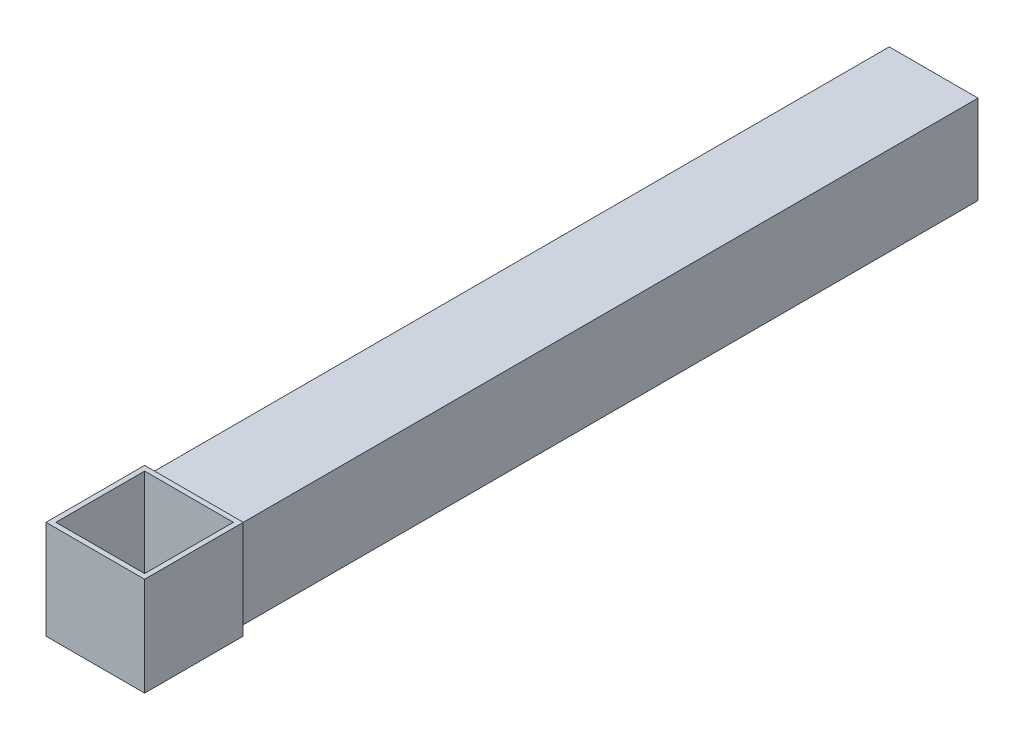
ISO-10303-21;
HEADER;
FILE_DESCRIPTION(('STEP AP214'),'2;1');
FILE_NAME('part.step','',(''),(''),'','','');
FILE_SCHEMA(('AUTOMOTIVE_DESIGN { 1 0 10303 214 1 1 1 1 }'));
ENDSEC;
DATA;
#1=APPLICATION_CONTEXT('core data for automotive mechanical design processes');
#2=APPLICATION_PROTOCOL_DEFINITION('international standard','automotive_design',2000,#1);
#3=PRODUCT_CONTEXT('',#1,'mechanical');
#4=PRODUCT('Part','Part','',(#3));
#5=PRODUCT_RELATED_PRODUCT_CATEGORY('part','',(#4));
#6=PRODUCT_DEFINITION_FORMATION('','',#4);
#7=PRODUCT_DEFINITION_CONTEXT('part definition',#1,'design');
#8=PRODUCT_DEFINITION('design','',#6,#7);
#9=PRODUCT_DEFINITION_SHAPE('','',#8);
#10=(LENGTH_UNIT() NAMED_UNIT(*) SI_UNIT(.MILLI.,.METRE.));
#11=(NAMED_UNIT(*) PLANE_ANGLE_UNIT() SI_UNIT($,.RADIAN.));
#12=(NAMED_UNIT(*) SI_UNIT($,.STERADIAN.) SOLID_ANGLE_UNIT());
#13=UNCERTAINTY_MEASURE_WITH_UNIT(LENGTH_MEASURE(1.E-05),#10,'distance_accuracy_value','');
#14=(GEOMETRIC_REPRESENTATION_CONTEXT(3) GLOBAL_UNCERTAINTY_ASSIGNED_CONTEXT((#13)) GLOBAL_UNIT_ASSIGNED_CONTEXT((#10,
#11,#12)) REPRESENTATION_CONTEXT('',''));
#15=CARTESIAN_POINT('',(0.,0.,0.));
#16=DIRECTION('',(0.,0.,1.));
#17=DIRECTION('',(1.,0.,0.));
#18=AXIS2_PLACEMENT_3D('',#15,#16,#17);
#19=CARTESIAN_POINT('',(18.,-18.,300.));
#20=DIRECTION('',(-1.,0.,0.));
#21=DIRECTION('',(0.,0.,1.));
#22=AXIS2_PLACEMENT_3D('',#19,#20,#21);
#23=PLANE('',#22);
#24=DIRECTION('',(0.,1.,0.));
#25=VECTOR('',#24,1.);
#26=CARTESIAN_POINT('',(18.,-18.,0.));
#27=LINE('',#26,#25);
#28=CARTESIAN_POINT('',(18.,-18.,0.));
#29=VERTEX_POINT('',#28);
#30=CARTESIAN_POINT('',(18.,18.,0.));
#31=VERTEX_POINT('',#30);
#32=EDGE_CURVE('E200',#29,#31,#27,.T.);
#33=ORIENTED_EDGE('',*,*,#32,.T.);
#34=DIRECTION('',(0.,0.,-1.));
#35=VECTOR('',#34,1.);
#36=CARTESIAN_POINT('',(18.,18.,300.));
#37=LINE('',#36,#35);
#38=CARTESIAN_POINT('',(18.,18.,300.));
#39=VERTEX_POINT('',#38);
#40=EDGE_CURVE('E11',#39,#31,#37,.T.);
#41=ORIENTED_EDGE('',*,*,#40,.F.);
#42=DIRECTION('',(0.,1.,0.));
#43=VECTOR('',#42,1.);
#44=CARTESIAN_POINT('',(18.,-18.,300.));
#45=LINE('',#44,#43);
#46=CARTESIAN_POINT('',(18.,-18.,300.));
#47=VERTEX_POINT('',#46);
#48=EDGE_CURVE('E206',#47,#39,#45,.T.);
#49=ORIENTED_EDGE('',*,*,#48,.F.);
#50=DIRECTION('',(0.,0.,-1.));
#51=VECTOR('',#50,1.);
#52=CARTESIAN_POINT('',(18.,-18.,300.));
#53=LINE('',#52,#51);
#54=EDGE_CURVE('E216',#47,#29,#53,.T.);
#55=ORIENTED_EDGE('',*,*,#54,.T.);
#56=EDGE_LOOP('',(#33,#41,#49,#55));
#57=FACE_BOUND('',#56,.T.);
#58=ADVANCED_FACE('F33',(#57),#23,.F.);
#59=CARTESIAN_POINT('',(-18.,18.,300.));
#60=DIRECTION('',(0.,-1.,0.));
#61=DIRECTION('',(0.,0.,-1.));
#62=AXIS2_PLACEMENT_3D('',#59,#60,#61);
#63=PLANE('',#62);
#64=DIRECTION('',(-1.,0.,0.));
#65=VECTOR('',#64,1.);
#66=CARTESIAN_POINT('',(-18.,18.,0.));
#67=LINE('',#66,#65);
#68=CARTESIAN_POINT('',(-18.,18.,0.));
#69=VERTEX_POINT('',#68);
#70=EDGE_CURVE('E219',#31,#69,#67,.T.);
#71=ORIENTED_EDGE('',*,*,#70,.T.);
#72=DIRECTION('',(0.,0.,-1.));
#73=VECTOR('',#72,1.);
#74=CARTESIAN_POINT('',(-18.,18.,300.));
#75=LINE('',#74,#73);
#76=CARTESIAN_POINT('',(-18.,18.,300.));
#77=VERTEX_POINT('',#76);
#78=EDGE_CURVE('E41',#77,#69,#75,.T.);
#79=ORIENTED_EDGE('',*,*,#78,.F.);
#80=DIRECTION('',(-1.,0.,0.));
#81=VECTOR('',#80,1.);
#82=CARTESIAN_POINT('',(-18.,18.,300.));
#83=LINE('',#82,#81);
#84=EDGE_CURVE('E75',#39,#77,#83,.T.);
#85=ORIENTED_EDGE('',*,*,#84,.F.);
#86=ORIENTED_EDGE('',*,*,#40,.T.);
#87=EDGE_LOOP('',(#71,#79,#85,#86));
#88=FACE_BOUND('',#87,.T.);
#89=ADVANCED_FACE('F263',(#88),#63,.F.);
#90=CARTESIAN_POINT('',(-18.,-18.,300.));
#91=DIRECTION('',(1.,0.,0.));
#92=DIRECTION('',(0.,0.,-1.));
#93=AXIS2_PLACEMENT_3D('',#90,#91,#92);
#94=PLANE('',#93);
#95=DIRECTION('',(0.,-1.,0.));
#96=VECTOR('',#95,1.);
#97=CARTESIAN_POINT('',(-18.,-18.,0.));
#98=LINE('',#97,#96);
#99=CARTESIAN_POINT('',(-18.,-18.,0.));
#100=VERTEX_POINT('',#99);
#101=EDGE_CURVE('E65',#69,#100,#98,.T.);
#102=ORIENTED_EDGE('',*,*,#101,.T.);
#103=DIRECTION('',(0.,0.,-1.));
#104=VECTOR('',#103,1.);
#105=CARTESIAN_POINT('',(-18.,-18.,300.));
#106=LINE('',#105,#104);
#107=CARTESIAN_POINT('',(-18.,-18.,300.));
#108=VERTEX_POINT('',#107);
#109=EDGE_CURVE('E49',#108,#100,#106,.T.);
#110=ORIENTED_EDGE('',*,*,#109,.F.);
#111=DIRECTION('',(0.,-1.,0.));
#112=VECTOR('',#111,1.);
#113=CARTESIAN_POINT('',(-18.,-18.,300.));
#114=LINE('',#113,#112);
#115=EDGE_CURVE('E210',#77,#108,#114,.T.);
#116=ORIENTED_EDGE('',*,*,#115,.F.);
#117=ORIENTED_EDGE('',*,*,#78,.T.);
#118=EDGE_LOOP('',(#102,#110,#116,#117));
#119=FACE_BOUND('',#118,.T.);
#120=ADVANCED_FACE('F224',(#119),#94,.F.);
#121=CARTESIAN_POINT('',(-18.,-18.,300.));
#122=DIRECTION('',(0.,1.,0.));
#123=DIRECTION('',(0.,0.,1.));
#124=AXIS2_PLACEMENT_3D('',#121,#122,#123);
#125=PLANE('',#124);
#126=DIRECTION('',(1.,0.,0.));
#127=VECTOR('',#126,1.);
#128=CARTESIAN_POINT('',(-18.,-18.,0.));
#129=LINE('',#128,#127);
#130=EDGE_CURVE('E70',#100,#29,#129,.T.);
#131=ORIENTED_EDGE('',*,*,#130,.T.);
#132=ORIENTED_EDGE('',*,*,#54,.F.);
#133=DIRECTION('',(1.,0.,0.));
#134=VECTOR('',#133,1.);
#135=CARTESIAN_POINT('',(-18.,-18.,300.));
#136=LINE('',#135,#134);
#137=EDGE_CURVE('E213',#108,#47,#136,.T.);
#138=ORIENTED_EDGE('',*,*,#137,.F.);
#139=ORIENTED_EDGE('',*,*,#109,.T.);
#140=EDGE_LOOP('',(#131,#132,#138,#139));
#141=FACE_BOUND('',#140,.T.);
#142=ADVANCED_FACE('F229',(#141),#125,.F.);
#143=CARTESIAN_POINT('',(0.,0.,0.));
#144=DIRECTION('',(0.,0.,-1.));
#145=DIRECTION('',(-1.,0.,0.));
#146=AXIS2_PLACEMENT_3D('',#143,#144,#145);
#147=PLANE('',#146);
#148=ORIENTED_EDGE('',*,*,#32,.F.);
#149=ORIENTED_EDGE('',*,*,#130,.F.);
#150=ORIENTED_EDGE('',*,*,#101,.F.);
#151=ORIENTED_EDGE('',*,*,#70,.F.);
#152=EDGE_LOOP('',(#148,#149,#150,#151));
#153=FACE_BOUND('',#152,.T.);
#154=ADVANCED_FACE('F227',(#153),#147,.T.);
#155=CARTESIAN_POINT('',(-20.,-20.,340.));
#156=DIRECTION('',(-1.,0.,0.));
#157=DIRECTION('',(0.,0.,1.));
#158=AXIS2_PLACEMENT_3D('',#155,#156,#157);
#159=PLANE('',#158);
#160=DIRECTION('',(0.,1.,0.));
#161=VECTOR('',#160,1.);
#162=CARTESIAN_POINT('',(-20.,-20.,340.));
#163=LINE('',#162,#161);
#164=CARTESIAN_POINT('',(-20.,-20.,340.));
#165=VERTEX_POINT('',#164);
#166=CARTESIAN_POINT('',(-20.,20.,340.));
#167=VERTEX_POINT('',#166);
#168=EDGE_CURVE('E197',#165,#167,#163,.T.);
#169=ORIENTED_EDGE('',*,*,#168,.T.);
#170=DIRECTION('',(0.,0.,1.));
#171=VECTOR('',#170,1.);
#172=CARTESIAN_POINT('',(-20.,20.,340.));
#173=LINE('',#172,#171);
#174=CARTESIAN_POINT('',(-20.,20.,300.));
#175=VERTEX_POINT('',#174);
#176=EDGE_CURVE('E161',#175,#167,#173,.T.);
#177=ORIENTED_EDGE('',*,*,#176,.F.);
#178=DIRECTION('',(0.,1.,0.));
#179=VECTOR('',#178,1.);
#180=CARTESIAN_POINT('',(-20.,-20.,300.));
#181=LINE('',#180,#179);
#182=CARTESIAN_POINT('',(-20.,-20.,300.));
#183=VERTEX_POINT('',#182);
#184=EDGE_CURVE('E198',#183,#175,#181,.T.);
#185=ORIENTED_EDGE('',*,*,#184,.F.);
#186=DIRECTION('',(0.,0.,1.));
#187=VECTOR('',#186,1.);
#188=CARTESIAN_POINT('',(-20.,-20.,340.));
#189=LINE('',#188,#187);
#190=EDGE_CURVE('E182',#183,#165,#189,.T.);
#191=ORIENTED_EDGE('',*,*,#190,.T.);
#192=EDGE_LOOP('',(#169,#177,#185,#191));
#193=FACE_BOUND('',#192,.T.);
#194=ADVANCED_FACE('F235',(#193),#159,.T.);
#195=CARTESIAN_POINT('',(-20.,-20.,300.));
#196=DIRECTION('',(0.,0.,-1.));
#197=DIRECTION('',(-1.,0.,0.));
#198=AXIS2_PLACEMENT_3D('',#195,#196,#197);
#199=PLANE('',#198);
#200=ORIENTED_EDGE('',*,*,#137,.T.);
#201=ORIENTED_EDGE('',*,*,#48,.T.);
#202=ORIENTED_EDGE('',*,*,#84,.T.);
#203=ORIENTED_EDGE('',*,*,#115,.T.);
#204=EDGE_LOOP('',(#200,#201,#202,#203));
#205=FACE_BOUND('',#204,.T.);
#206=ORIENTED_EDGE('',*,*,#184,.T.);
#207=DIRECTION('',(-1.,0.,0.));
#208=VECTOR('',#207,1.);
#209=CARTESIAN_POINT('',(-20.,20.,300.));
#210=LINE('',#209,#208);
#211=CARTESIAN_POINT('',(20.,20.,300.));
#212=VERTEX_POINT('',#211);
#213=EDGE_CURVE('E170',#212,#175,#210,.T.);
#214=ORIENTED_EDGE('',*,*,#213,.F.);
#215=DIRECTION('',(0.,1.,0.));
#216=VECTOR('',#215,1.);
#217=CARTESIAN_POINT('',(20.,-20.,300.));
#218=LINE('',#217,#216);
#219=CARTESIAN_POINT('',(20.,-20.,300.));
#220=VERTEX_POINT('',#219);
#221=EDGE_CURVE('E201',#220,#212,#218,.T.);
#222=ORIENTED_EDGE('',*,*,#221,.F.);
#223=DIRECTION('',(-1.,0.,0.));
#224=VECTOR('',#223,1.);
#225=CARTESIAN_POINT('',(-20.,-20.,300.));
#226=LINE('',#225,#224);
#227=EDGE_CURVE('E194',#220,#183,#226,.T.);
#228=ORIENTED_EDGE('',*,*,#227,.T.);
#229=EDGE_LOOP('',(#206,#214,#222,#228));
#230=FACE_BOUND('',#229,.T.);
#231=ADVANCED_FACE('F231',(#205,#230),#199,.T.);
#232=CARTESIAN_POINT('',(20.,-20.,340.));
#233=DIRECTION('',(1.,0.,0.));
#234=DIRECTION('',(0.,0.,-1.));
#235=AXIS2_PLACEMENT_3D('',#232,#233,#234);
#236=PLANE('',#235);
#237=ORIENTED_EDGE('',*,*,#221,.T.);
#238=DIRECTION('',(0.,0.,-1.));
#239=VECTOR('',#238,1.);
#240=CARTESIAN_POINT('',(20.,20.,340.));
#241=LINE('',#240,#239);
#242=CARTESIAN_POINT('',(20.,20.,340.));
#243=VERTEX_POINT('',#242);
#244=EDGE_CURVE('E167',#243,#212,#241,.T.);
#245=ORIENTED_EDGE('',*,*,#244,.F.);
#246=DIRECTION('',(0.,1.,0.));
#247=VECTOR('',#246,1.);
#248=CARTESIAN_POINT('',(20.,-20.,340.));
#249=LINE('',#248,#247);
#250=CARTESIAN_POINT('',(20.,-20.,340.));
#251=VERTEX_POINT('',#250);
#252=EDGE_CURVE('E203',#251,#243,#249,.T.);
#253=ORIENTED_EDGE('',*,*,#252,.F.);
#254=DIRECTION('',(0.,0.,-1.));
#255=VECTOR('',#254,1.);
#256=CARTESIAN_POINT('',(20.,-20.,340.));
#257=LINE('',#256,#255);
#258=EDGE_CURVE('E191',#251,#220,#257,.T.);
#259=ORIENTED_EDGE('',*,*,#258,.T.);
#260=EDGE_LOOP('',(#237,#245,#253,#259));
#261=FACE_BOUND('',#260,.T.);
#262=ADVANCED_FACE('F234',(#261),#236,.T.);
#263=CARTESIAN_POINT('',(-20.,-20.,340.));
#264=DIRECTION('',(0.,0.,1.));
#265=DIRECTION('',(1.,0.,0.));
#266=AXIS2_PLACEMENT_3D('',#263,#264,#265);
#267=PLANE('',#266);
#268=ORIENTED_EDGE('',*,*,#252,.T.);
#269=DIRECTION('',(1.,0.,0.));
#270=VECTOR('',#269,1.);
#271=CARTESIAN_POINT('',(-20.,20.,340.));
#272=LINE('',#271,#270);
#273=EDGE_CURVE('E164',#167,#243,#272,.T.);
#274=ORIENTED_EDGE('',*,*,#273,.F.);
#275=ORIENTED_EDGE('',*,*,#168,.F.);
#276=DIRECTION('',(1.,0.,0.));
#277=VECTOR('',#276,1.);
#278=CARTESIAN_POINT('',(-20.,-20.,340.));
#279=LINE('',#278,#277);
#280=EDGE_CURVE('E188',#165,#251,#279,.T.);
#281=ORIENTED_EDGE('',*,*,#280,.T.);
#282=EDGE_LOOP('',(#268,#274,#275,#281));
#283=FACE_BOUND('',#282,.T.);
#284=ADVANCED_FACE('F247',(#283),#267,.T.);
#285=CARTESIAN_POINT('',(0.,-20.,0.));
#286=DIRECTION('',(0.,-1.,0.));
#287=DIRECTION('',(0.,0.,-1.));
#288=AXIS2_PLACEMENT_3D('',#285,#286,#287);
#289=PLANE('',#288);
#290=DIRECTION('',(0.,0.,-1.));
#291=VECTOR('',#290,1.);
#292=CARTESIAN_POINT('',(18.,-20.,338.));
#293=LINE('',#292,#291);
#294=CARTESIAN_POINT('',(18.,-20.,338.));
#295=VERTEX_POINT('',#294);
#296=CARTESIAN_POINT('',(18.,-20.,302.));
#297=VERTEX_POINT('',#296);
#298=EDGE_CURVE('E173',#295,#297,#293,.T.);
#299=ORIENTED_EDGE('',*,*,#298,.T.);
#300=DIRECTION('',(-1.,0.,0.));
#301=VECTOR('',#300,1.);
#302=CARTESIAN_POINT('',(-18.,-20.,302.));
#303=LINE('',#302,#301);
#304=CARTESIAN_POINT('',(-18.,-20.,302.));
#305=VERTEX_POINT('',#304);
#306=EDGE_CURVE('E138',#297,#305,#303,.T.);
#307=ORIENTED_EDGE('',*,*,#306,.T.);
#308=DIRECTION('',(0.,0.,1.));
#309=VECTOR('',#308,1.);
#310=CARTESIAN_POINT('',(-18.,-20.,338.));
#311=LINE('',#310,#309);
#312=CARTESIAN_POINT('',(-18.,-20.,338.));
#313=VERTEX_POINT('',#312);
#314=EDGE_CURVE('E176',#305,#313,#311,.T.);
#315=ORIENTED_EDGE('',*,*,#314,.T.);
#316=DIRECTION('',(1.,0.,0.));
#317=VECTOR('',#316,1.);
#318=CARTESIAN_POINT('',(-18.,-20.,338.));
#319=LINE('',#318,#317);
#320=EDGE_CURVE('E143',#313,#295,#319,.T.);
#321=ORIENTED_EDGE('',*,*,#320,.T.);
#322=EDGE_LOOP('',(#299,#307,#315,#321));
#323=FACE_BOUND('',#322,.T.);
#324=ORIENTED_EDGE('',*,*,#190,.F.);
#325=ORIENTED_EDGE('',*,*,#227,.F.);
#326=ORIENTED_EDGE('',*,*,#258,.F.);
#327=ORIENTED_EDGE('',*,*,#280,.F.);
#328=EDGE_LOOP('',(#324,#325,#326,#327));
#329=FACE_BOUND('',#328,.T.);
#330=ADVANCED_FACE('F251',(#323,#329),#289,.T.);
#331=CARTESIAN_POINT('',(18.,-20.,338.));
#332=DIRECTION('',(1.,0.,0.));
#333=DIRECTION('',(0.,0.,-1.));
#334=AXIS2_PLACEMENT_3D('',#331,#332,#333);
#335=PLANE('',#334);
#336=DIRECTION('',(0.,1.,0.));
#337=VECTOR('',#336,1.);
#338=CARTESIAN_POINT('',(18.,-20.,338.));
#339=LINE('',#338,#337);
#340=CARTESIAN_POINT('',(18.,20.,338.));
#341=VERTEX_POINT('',#340);
#342=EDGE_CURVE('E148',#295,#341,#339,.T.);
#343=ORIENTED_EDGE('',*,*,#342,.T.);
#344=DIRECTION('',(0.,0.,-1.));
#345=VECTOR('',#344,1.);
#346=CARTESIAN_POINT('',(18.,20.,338.));
#347=LINE('',#346,#345);
#348=CARTESIAN_POINT('',(18.,20.,302.));
#349=VERTEX_POINT('',#348);
#350=EDGE_CURVE('E146',#341,#349,#347,.T.);
#351=ORIENTED_EDGE('',*,*,#350,.T.);
#352=DIRECTION('',(0.,1.,0.));
#353=VECTOR('',#352,1.);
#354=CARTESIAN_POINT('',(18.,-20.,302.));
#355=LINE('',#354,#353);
#356=EDGE_CURVE('E130',#297,#349,#355,.T.);
#357=ORIENTED_EDGE('',*,*,#356,.F.);
#358=ORIENTED_EDGE('',*,*,#298,.F.);
#359=EDGE_LOOP('',(#343,#351,#357,#358));
#360=FACE_BOUND('',#359,.T.);
#361=ADVANCED_FACE('F147',(#360),#335,.F.);
#362=CARTESIAN_POINT('',(-18.,-20.,338.));
#363=DIRECTION('',(0.,0.,1.));
#364=DIRECTION('',(1.,0.,0.));
#365=AXIS2_PLACEMENT_3D('',#362,#363,#364);
#366=PLANE('',#365);
#367=DIRECTION('',(0.,1.,0.));
#368=VECTOR('',#367,1.);
#369=CARTESIAN_POINT('',(-18.,-20.,338.));
#370=LINE('',#369,#368);
#371=CARTESIAN_POINT('',(-18.,20.,338.));
#372=VERTEX_POINT('',#371);
#373=EDGE_CURVE('E183',#313,#372,#370,.T.);
#374=ORIENTED_EDGE('',*,*,#373,.T.);
#375=DIRECTION('',(1.,0.,0.));
#376=VECTOR('',#375,1.);
#377=CARTESIAN_POINT('',(-18.,20.,338.));
#378=LINE('',#377,#376);
#379=EDGE_CURVE('E157',#372,#341,#378,.T.);
#380=ORIENTED_EDGE('',*,*,#379,.T.);
#381=ORIENTED_EDGE('',*,*,#342,.F.);
#382=ORIENTED_EDGE('',*,*,#320,.F.);
#383=EDGE_LOOP('',(#374,#380,#381,#382));
#384=FACE_BOUND('',#383,.T.);
#385=ADVANCED_FACE('F259',(#384),#366,.F.);
#386=CARTESIAN_POINT('',(-18.,-20.,338.));
#387=DIRECTION('',(-1.,0.,0.));
#388=DIRECTION('',(0.,0.,1.));
#389=AXIS2_PLACEMENT_3D('',#386,#387,#388);
#390=PLANE('',#389);
#391=DIRECTION('',(0.,1.,0.));
#392=VECTOR('',#391,1.);
#393=CARTESIAN_POINT('',(-18.,-20.,302.));
#394=LINE('',#393,#392);
#395=CARTESIAN_POINT('',(-18.,20.,302.));
#396=VERTEX_POINT('',#395);
#397=EDGE_CURVE('E142',#305,#396,#394,.T.);
#398=ORIENTED_EDGE('',*,*,#397,.T.);
#399=DIRECTION('',(0.,0.,1.));
#400=VECTOR('',#399,1.);
#401=CARTESIAN_POINT('',(-18.,20.,338.));
#402=LINE('',#401,#400);
#403=EDGE_CURVE('E155',#396,#372,#402,.T.);
#404=ORIENTED_EDGE('',*,*,#403,.T.);
#405=ORIENTED_EDGE('',*,*,#373,.F.);
#406=ORIENTED_EDGE('',*,*,#314,.F.);
#407=EDGE_LOOP('',(#398,#404,#405,#406));
#408=FACE_BOUND('',#407,.T.);
#409=ADVANCED_FACE('F306',(#408),#390,.F.);
#410=CARTESIAN_POINT('',(-18.,-20.,302.));
#411=DIRECTION('',(0.,0.,-1.));
#412=DIRECTION('',(-1.,0.,0.));
#413=AXIS2_PLACEMENT_3D('',#410,#411,#412);
#414=PLANE('',#413);
#415=ORIENTED_EDGE('',*,*,#356,.T.);
#416=DIRECTION('',(-1.,0.,0.));
#417=VECTOR('',#416,1.);
#418=CARTESIAN_POINT('',(-18.,20.,302.));
#419=LINE('',#418,#417);
#420=EDGE_CURVE('E135',#349,#396,#419,.T.);
#421=ORIENTED_EDGE('',*,*,#420,.T.);
#422=ORIENTED_EDGE('',*,*,#397,.F.);
#423=ORIENTED_EDGE('',*,*,#306,.F.);
#424=EDGE_LOOP('',(#415,#421,#422,#423));
#425=FACE_BOUND('',#424,.T.);
#426=ADVANCED_FACE('F132',(#425),#414,.F.);
#427=CARTESIAN_POINT('',(0.,20.,0.));
#428=DIRECTION('',(0.,-1.,0.));
#429=DIRECTION('',(0.,0.,-1.));
#430=AXIS2_PLACEMENT_3D('',#427,#428,#429);
#431=PLANE('',#430);
#432=ORIENTED_EDGE('',*,*,#176,.T.);
#433=ORIENTED_EDGE('',*,*,#273,.T.);
#434=ORIENTED_EDGE('',*,*,#244,.T.);
#435=ORIENTED_EDGE('',*,*,#213,.T.);
#436=EDGE_LOOP('',(#432,#433,#434,#435));
#437=FACE_BOUND('',#436,.T.);
#438=ORIENTED_EDGE('',*,*,#350,.F.);
#439=ORIENTED_EDGE('',*,*,#379,.F.);
#440=ORIENTED_EDGE('',*,*,#403,.F.);
#441=ORIENTED_EDGE('',*,*,#420,.F.);
#442=EDGE_LOOP('',(#438,#439,#440,#441));
#443=FACE_BOUND('',#442,.T.);
#444=ADVANCED_FACE('F153',(#437,#443),#431,.F.);
#445=CLOSED_SHELL('',(#58,#89,#120,#142,#154,#194,#231,#262,#284,#330,#361,#385,#409,#426,#444));
#446=MANIFOLD_SOLID_BREP('B2',#445);
#447=ADVANCED_BREP_SHAPE_REPRESENTATION('',(#18,#446),#14);
#448=SHAPE_DEFINITION_REPRESENTATION(#9,#447);
ENDSEC;
END-ISO-10303-21;
